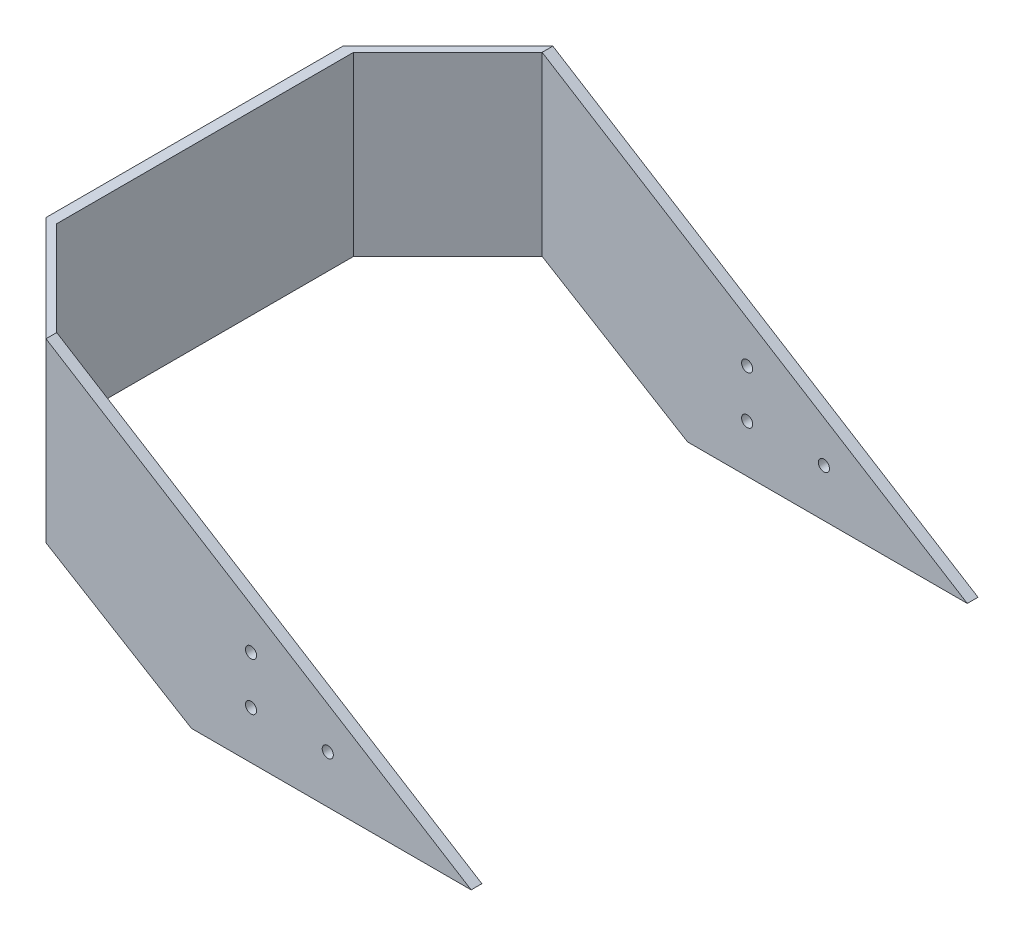
ISO-10303-21;
HEADER;
FILE_DESCRIPTION(('STEP AP214'),'2;1');
FILE_NAME('part.step','',(''),(''),'','','');
FILE_SCHEMA(('AUTOMOTIVE_DESIGN { 1 0 10303 214 1 1 1 1 }'));
ENDSEC;
DATA;
#1=APPLICATION_CONTEXT('core data for automotive mechanical design processes');
#2=APPLICATION_PROTOCOL_DEFINITION('international standard','automotive_design',2000,#1);
#3=PRODUCT_CONTEXT('',#1,'mechanical');
#4=PRODUCT('Part','Part','',(#3));
#5=PRODUCT_RELATED_PRODUCT_CATEGORY('part','',(#4));
#6=PRODUCT_DEFINITION_FORMATION('','',#4);
#7=PRODUCT_DEFINITION_CONTEXT('part definition',#1,'design');
#8=PRODUCT_DEFINITION('design','',#6,#7);
#9=PRODUCT_DEFINITION_SHAPE('','',#8);
#10=(LENGTH_UNIT() NAMED_UNIT(*) SI_UNIT(.MILLI.,.METRE.));
#11=(NAMED_UNIT(*) PLANE_ANGLE_UNIT() SI_UNIT($,.RADIAN.));
#12=(NAMED_UNIT(*) SI_UNIT($,.STERADIAN.) SOLID_ANGLE_UNIT());
#13=UNCERTAINTY_MEASURE_WITH_UNIT(LENGTH_MEASURE(1.E-05),#10,'distance_accuracy_value','');
#14=(GEOMETRIC_REPRESENTATION_CONTEXT(3) GLOBAL_UNCERTAINTY_ASSIGNED_CONTEXT((#13)) GLOBAL_UNIT_ASSIGNED_CONTEXT((#10,
#11,#12)) REPRESENTATION_CONTEXT('',''));
#15=CARTESIAN_POINT('',(0.,0.,0.));
#16=DIRECTION('',(0.,0.,1.));
#17=DIRECTION('',(1.,0.,0.));
#18=AXIS2_PLACEMENT_3D('',#15,#16,#17);
#19=CARTESIAN_POINT('',(0.,0.,-150.225396744416));
#20=DIRECTION('',(0.,0.,1.));
#21=DIRECTION('',(1.,0.,0.));
#22=AXIS2_PLACEMENT_3D('',#19,#20,#21);
#23=PLANE('',#22);
#24=CARTESIAN_POINT('',(-130.499303898,56.671423106,-150.225396744416));
#25=DIRECTION('',(0.,0.,-1.));
#26=DIRECTION('',(-1.,0.,0.));
#27=AXIS2_PLACEMENT_3D('',#24,#25,#26);
#28=CIRCLE('',#27,3.3);
#29=CARTESIAN_POINT('',(-133.799303898,56.671423106,-150.225396744416));
#30=VERTEX_POINT('',#29);
#31=EDGE_CURVE('E288',#30,#30,#28,.T.);
#32=ORIENTED_EDGE('',*,*,#31,.F.);
#33=EDGE_LOOP('',(#32));
#34=FACE_BOUND('',#33,.T.);
#35=CARTESIAN_POINT('',(-84.991984194,28.335711553,-150.225396744416));
#36=DIRECTION('',(0.,0.,-1.));
#37=DIRECTION('',(-1.,0.,0.));
#38=AXIS2_PLACEMENT_3D('',#35,#36,#37);
#39=CIRCLE('',#38,3.3);
#40=CARTESIAN_POINT('',(-88.291984194,28.335711553,-150.225396744416));
#41=VERTEX_POINT('',#40);
#42=EDGE_CURVE('E299',#41,#41,#39,.T.);
#43=ORIENTED_EDGE('',*,*,#42,.F.);
#44=EDGE_LOOP('',(#43));
#45=FACE_BOUND('',#44,.T.);
#46=DIRECTION('',(-0.855715818311566,0.517446072834037,0.));
#47=VECTOR('',#46,1.);
#48=CARTESIAN_POINT('',(-44.3905854683164,-73.4100192534136,-150.225396744416));
#49=LINE('',#48,#47);
#50=CARTESIAN_POINT('',(-165.790897492427,0.,-150.225396744416));
#51=VERTEX_POINT('',#50);
#52=CARTESIAN_POINT('',(-252.031500000006,52.1491599564427,-150.225396744416));
#53=VERTEX_POINT('',#52);
#54=EDGE_CURVE('E209',#51,#53,#49,.T.);
#55=ORIENTED_EDGE('',*,*,#54,.T.);
#56=DIRECTION('',(0.,-1.,0.));
#57=VECTOR('',#56,1.);
#58=CARTESIAN_POINT('',(-252.031500000007,156.924825641824,-150.225396744416));
#59=LINE('',#58,#57);
#60=CARTESIAN_POINT('',(-252.031500000007,156.924825641824,-150.225396744416));
#61=VERTEX_POINT('',#60);
#62=EDGE_CURVE('E121',#61,#53,#59,.T.);
#63=ORIENTED_EDGE('',*,*,#62,.F.);
#64=DIRECTION('',(-0.848897585926299,0.528557365485055,0.));
#65=VECTOR('',#64,1.);
#66=CARTESIAN_POINT('',(0.,0.,-150.225396744416));
#67=LINE('',#66,#65);
#68=CARTESIAN_POINT('',(0.,0.,-150.225396744416));
#69=VERTEX_POINT('',#68);
#70=EDGE_CURVE('E198',#69,#61,#67,.T.);
#71=ORIENTED_EDGE('',*,*,#70,.F.);
#72=DIRECTION('',(1.,0.,0.));
#73=VECTOR('',#72,1.);
#74=CARTESIAN_POINT('',(0.,0.,-150.225396744416));
#75=LINE('',#74,#73);
#76=EDGE_CURVE('E201',#51,#69,#75,.T.);
#77=ORIENTED_EDGE('',*,*,#76,.F.);
#78=EDGE_LOOP('',(#55,#63,#71,#77));
#79=FACE_BOUND('',#78,.T.);
#80=CARTESIAN_POINT('',(-130.499303898,28.335711553,-150.225396744416));
#81=DIRECTION('',(0.,0.,-1.));
#82=DIRECTION('',(-1.,0.,0.));
#83=AXIS2_PLACEMENT_3D('',#80,#81,#82);
#84=CIRCLE('',#83,3.3);
#85=CARTESIAN_POINT('',(-133.799303898,28.335711553,-150.225396744416));
#86=VERTEX_POINT('',#85);
#87=EDGE_CURVE('E282',#86,#86,#84,.T.);
#88=ORIENTED_EDGE('',*,*,#87,.F.);
#89=EDGE_LOOP('',(#88));
#90=FACE_BOUND('',#89,.T.);
#91=ADVANCED_FACE('F41',(#34,#45,#79,#90),#23,.F.);
#92=CARTESIAN_POINT('',(-307.906896744423,156.924825641824,0.));
#93=DIRECTION('',(-1.,0.,0.));
#94=DIRECTION('',(0.,0.,1.));
#95=AXIS2_PLACEMENT_3D('',#92,#93,#94);
#96=PLANE('',#95);
#97=DIRECTION('',(0.,0.,-1.));
#98=VECTOR('',#97,1.);
#99=CARTESIAN_POINT('',(-307.906896744423,52.1491599564428,0.));
#100=LINE('',#99,#98);
#101=CARTESIAN_POINT('',(-307.906896744423,52.1491599564428,88.));
#102=VERTEX_POINT('',#101);
#103=CARTESIAN_POINT('',(-307.906896744423,52.1491599564428,-88.));
#104=VERTEX_POINT('',#103);
#105=EDGE_CURVE('E145',#102,#104,#100,.T.);
#106=ORIENTED_EDGE('',*,*,#105,.T.);
#107=DIRECTION('',(0.,-1.,0.));
#108=VECTOR('',#107,1.);
#109=CARTESIAN_POINT('',(-307.906896744423,156.924825641824,-88.));
#110=LINE('',#109,#108);
#111=CARTESIAN_POINT('',(-307.906896744423,156.924825641824,-88.));
#112=VERTEX_POINT('',#111);
#113=EDGE_CURVE('E11',#112,#104,#110,.T.);
#114=ORIENTED_EDGE('',*,*,#113,.F.);
#115=DIRECTION('',(0.,0.,-1.));
#116=VECTOR('',#115,1.);
#117=CARTESIAN_POINT('',(-307.906896744423,156.924825641824,0.));
#118=LINE('',#117,#116);
#119=CARTESIAN_POINT('',(-307.906896744423,156.924825641824,88.));
#120=VERTEX_POINT('',#119);
#121=EDGE_CURVE('E164',#120,#112,#118,.T.);
#122=ORIENTED_EDGE('',*,*,#121,.F.);
#123=DIRECTION('',(0.,-1.,0.));
#124=VECTOR('',#123,1.);
#125=CARTESIAN_POINT('',(-307.906896744423,156.924825641824,88.));
#126=LINE('',#125,#124);
#127=EDGE_CURVE('E144',#120,#102,#126,.T.);
#128=ORIENTED_EDGE('',*,*,#127,.T.);
#129=EDGE_LOOP('',(#106,#114,#122,#128));
#130=FACE_BOUND('',#129,.T.);
#131=ADVANCED_FACE('F43',(#130),#96,.F.);
#132=CARTESIAN_POINT('',(-197.953448372211,156.924825641824,-197.953448372212));
#133=DIRECTION('',(-0.707106781186547,0.,-0.707106781186548));
#134=DIRECTION('',(-0.707106781186548,0.,0.707106781186547));
#135=AXIS2_PLACEMENT_3D('',#132,#133,#134);
#136=PLANE('',#135);
#137=DIRECTION('',(0.707106781186548,0.,-0.707106781186547));
#138=VECTOR('',#137,1.);
#139=CARTESIAN_POINT('',(-197.953448372211,52.1491599564428,-197.953448372212));
#140=LINE('',#139,#138);
#141=CARTESIAN_POINT('',(-252.031500000007,52.1491599564428,-143.875396744416));
#142=VERTEX_POINT('',#141);
#143=EDGE_CURVE('E148',#104,#142,#140,.T.);
#144=ORIENTED_EDGE('',*,*,#143,.T.);
#145=DIRECTION('',(0.,-1.,0.));
#146=VECTOR('',#145,1.);
#147=CARTESIAN_POINT('',(-252.031500000007,156.924825641824,-143.875396744416));
#148=LINE('',#147,#146);
#149=CARTESIAN_POINT('',(-252.031500000007,156.924825641824,-143.875396744416));
#150=VERTEX_POINT('',#149);
#151=EDGE_CURVE('E50',#150,#142,#148,.T.);
#152=ORIENTED_EDGE('',*,*,#151,.F.);
#153=DIRECTION('',(0.707106781186548,0.,-0.707106781186547));
#154=VECTOR('',#153,1.);
#155=CARTESIAN_POINT('',(-197.953448372211,156.924825641824,-197.953448372212));
#156=LINE('',#155,#154);
#157=EDGE_CURVE('E98',#112,#150,#156,.T.);
#158=ORIENTED_EDGE('',*,*,#157,.F.);
#159=ORIENTED_EDGE('',*,*,#113,.T.);
#160=EDGE_LOOP('',(#144,#152,#158,#159));
#161=FACE_BOUND('',#160,.T.);
#162=ADVANCED_FACE('F182',(#161),#136,.F.);
#163=CARTESIAN_POINT('',(-201.128448372211,156.924825641824,-201.128448372212));
#164=DIRECTION('',(-0.707106781186547,0.,-0.707106781186548));
#165=DIRECTION('',(-0.707106781186548,0.,0.707106781186547));
#166=AXIS2_PLACEMENT_3D('',#163,#164,#165);
#167=PLANE('',#166);
#168=DIRECTION('',(0.707106781186548,0.,-0.707106781186547));
#169=VECTOR('',#168,1.);
#170=CARTESIAN_POINT('',(-201.128448372211,52.1491599564428,-201.128448372212));
#171=LINE('',#170,#169);
#172=CARTESIAN_POINT('',(-314.256896744423,52.1491599564428,-88.));
#173=VERTEX_POINT('',#172);
#174=EDGE_CURVE('E118',#173,#53,#171,.T.);
#175=ORIENTED_EDGE('',*,*,#174,.F.);
#176=DIRECTION('',(0.,-1.,0.));
#177=VECTOR('',#176,1.);
#178=CARTESIAN_POINT('',(-314.256896744423,156.924825641824,-88.));
#179=LINE('',#178,#177);
#180=CARTESIAN_POINT('',(-314.256896744423,156.924825641824,-88.));
#181=VERTEX_POINT('',#180);
#182=EDGE_CURVE('E110',#181,#173,#179,.T.);
#183=ORIENTED_EDGE('',*,*,#182,.F.);
#184=DIRECTION('',(0.707106781186548,0.,-0.707106781186547));
#185=VECTOR('',#184,1.);
#186=CARTESIAN_POINT('',(-201.128448372211,156.924825641824,-201.128448372212));
#187=LINE('',#186,#185);
#188=EDGE_CURVE('E115',#181,#61,#187,.T.);
#189=ORIENTED_EDGE('',*,*,#188,.T.);
#190=ORIENTED_EDGE('',*,*,#62,.T.);
#191=EDGE_LOOP('',(#175,#183,#189,#190));
#192=FACE_BOUND('',#191,.T.);
#193=ADVANCED_FACE('F112',(#192),#167,.T.);
#194=CARTESIAN_POINT('',(-314.256896744423,156.924825641824,0.));
#195=DIRECTION('',(1.,0.,0.));
#196=DIRECTION('',(0.,0.,-1.));
#197=AXIS2_PLACEMENT_3D('',#194,#195,#196);
#198=PLANE('',#197);
#199=DIRECTION('',(0.,0.,1.));
#200=VECTOR('',#199,1.);
#201=CARTESIAN_POINT('',(-314.256896744423,52.1491599564428,0.));
#202=LINE('',#201,#200);
#203=CARTESIAN_POINT('',(-314.256896744423,52.1491599564428,88.));
#204=VERTEX_POINT('',#203);
#205=EDGE_CURVE('E155',#173,#204,#202,.T.);
#206=ORIENTED_EDGE('',*,*,#205,.T.);
#207=DIRECTION('',(0.,-1.,0.));
#208=VECTOR('',#207,1.);
#209=CARTESIAN_POINT('',(-314.256896744423,156.924825641824,88.));
#210=LINE('',#209,#208);
#211=CARTESIAN_POINT('',(-314.256896744423,156.924825641824,88.));
#212=VERTEX_POINT('',#211);
#213=EDGE_CURVE('E122',#212,#204,#210,.T.);
#214=ORIENTED_EDGE('',*,*,#213,.F.);
#215=DIRECTION('',(0.,0.,1.));
#216=VECTOR('',#215,1.);
#217=CARTESIAN_POINT('',(-314.256896744423,156.924825641824,0.));
#218=LINE('',#217,#216);
#219=EDGE_CURVE('E125',#181,#212,#218,.T.);
#220=ORIENTED_EDGE('',*,*,#219,.F.);
#221=ORIENTED_EDGE('',*,*,#182,.T.);
#222=EDGE_LOOP('',(#206,#214,#220,#221));
#223=FACE_BOUND('',#222,.T.);
#224=ADVANCED_FACE('F126',(#223),#198,.F.);
#225=CARTESIAN_POINT('',(-201.128448372212,156.924825641824,201.128448372212));
#226=DIRECTION('',(0.707106781186548,0.,-0.707106781186547));
#227=DIRECTION('',(-0.707106781186547,0.,-0.707106781186548));
#228=AXIS2_PLACEMENT_3D('',#225,#226,#227);
#229=PLANE('',#228);
#230=DIRECTION('',(0.707106781186547,0.,0.707106781186548));
#231=VECTOR('',#230,1.);
#232=CARTESIAN_POINT('',(-201.128448372212,52.1491599564428,201.128448372212));
#233=LINE('',#232,#231);
#234=CARTESIAN_POINT('',(-252.031500000006,52.1491599564428,150.225396744417));
#235=VERTEX_POINT('',#234);
#236=EDGE_CURVE('E157',#204,#235,#233,.T.);
#237=ORIENTED_EDGE('',*,*,#236,.T.);
#238=DIRECTION('',(0.,-1.,0.));
#239=VECTOR('',#238,1.);
#240=CARTESIAN_POINT('',(-252.031500000006,156.924825641824,150.225396744417));
#241=LINE('',#240,#239);
#242=CARTESIAN_POINT('',(-252.031500000006,156.924825641824,150.225396744414));
#243=VERTEX_POINT('',#242);
#244=EDGE_CURVE('E168',#243,#235,#241,.T.);
#245=ORIENTED_EDGE('',*,*,#244,.F.);
#246=DIRECTION('',(0.707106781186547,0.,0.707106781186548));
#247=VECTOR('',#246,1.);
#248=CARTESIAN_POINT('',(-201.128448372212,156.924825641824,201.128448372212));
#249=LINE('',#248,#247);
#250=EDGE_CURVE('E130',#212,#243,#249,.T.);
#251=ORIENTED_EDGE('',*,*,#250,.F.);
#252=ORIENTED_EDGE('',*,*,#213,.T.);
#253=EDGE_LOOP('',(#237,#245,#251,#252));
#254=FACE_BOUND('',#253,.T.);
#255=ADVANCED_FACE('F351',(#254),#229,.F.);
#256=CARTESIAN_POINT('',(-197.953448372212,156.924825641824,197.953448372212));
#257=DIRECTION('',(-0.707106781186548,0.,0.707106781186547));
#258=DIRECTION('',(0.707106781186547,0.,0.707106781186548));
#259=AXIS2_PLACEMENT_3D('',#256,#257,#258);
#260=PLANE('',#259);
#261=DIRECTION('',(-0.707106781186547,0.,-0.707106781186548));
#262=VECTOR('',#261,1.);
#263=CARTESIAN_POINT('',(-197.953448372212,52.1491599564428,197.953448372212));
#264=LINE('',#263,#262);
#265=CARTESIAN_POINT('',(-252.031500000006,52.1491599564427,143.875396744417));
#266=VERTEX_POINT('',#265);
#267=EDGE_CURVE('E90',#266,#102,#264,.T.);
#268=ORIENTED_EDGE('',*,*,#267,.T.);
#269=ORIENTED_EDGE('',*,*,#127,.F.);
#270=DIRECTION('',(-0.707106781186547,0.,-0.707106781186548));
#271=VECTOR('',#270,1.);
#272=CARTESIAN_POINT('',(-197.953448372212,156.924825641824,197.953448372212));
#273=LINE('',#272,#271);
#274=CARTESIAN_POINT('',(-252.031500000006,156.924825641824,143.875396744417));
#275=VERTEX_POINT('',#274);
#276=EDGE_CURVE('E58',#275,#120,#273,.T.);
#277=ORIENTED_EDGE('',*,*,#276,.F.);
#278=DIRECTION('',(0.,-1.,0.));
#279=VECTOR('',#278,1.);
#280=CARTESIAN_POINT('',(-252.031500000006,156.924825641824,143.875396744417));
#281=LINE('',#280,#279);
#282=EDGE_CURVE('E166',#275,#266,#281,.T.);
#283=ORIENTED_EDGE('',*,*,#282,.T.);
#284=EDGE_LOOP('',(#268,#269,#277,#283));
#285=FACE_BOUND('',#284,.T.);
#286=ADVANCED_FACE('F346',(#285),#260,.F.);
#287=CARTESIAN_POINT('',(0.,156.924825641824,0.));
#288=DIRECTION('',(0.,1.,0.));
#289=DIRECTION('',(0.,0.,1.));
#290=AXIS2_PLACEMENT_3D('',#287,#288,#289);
#291=PLANE('',#290);
#292=ORIENTED_EDGE('',*,*,#121,.T.);
#293=ORIENTED_EDGE('',*,*,#157,.T.);
#294=DIRECTION('',(0.,0.,-1.));
#295=VECTOR('',#294,1.);
#296=CARTESIAN_POINT('',(-252.031500000007,156.924825641824,0.));
#297=LINE('',#296,#295);
#298=EDGE_CURVE('E134',#150,#61,#297,.T.);
#299=ORIENTED_EDGE('',*,*,#298,.T.);
#300=ORIENTED_EDGE('',*,*,#188,.F.);
#301=ORIENTED_EDGE('',*,*,#219,.T.);
#302=ORIENTED_EDGE('',*,*,#250,.T.);
#303=DIRECTION('',(0.,0.,1.));
#304=VECTOR('',#303,1.);
#305=CARTESIAN_POINT('',(-252.031499999996,156.924825641824,-1.76259007389496E-11));
#306=LINE('',#305,#304);
#307=EDGE_CURVE('E140',#275,#243,#306,.T.);
#308=ORIENTED_EDGE('',*,*,#307,.F.);
#309=ORIENTED_EDGE('',*,*,#276,.T.);
#310=EDGE_LOOP('',(#292,#293,#299,#300,#301,#302,#308,#309));
#311=FACE_BOUND('',#310,.T.);
#312=ADVANCED_FACE('F132',(#311),#291,.T.);
#313=CARTESIAN_POINT('',(0.,52.1491599564428,0.));
#314=DIRECTION('',(0.,1.,0.));
#315=DIRECTION('',(0.,0.,1.));
#316=AXIS2_PLACEMENT_3D('',#313,#314,#315);
#317=PLANE('',#316);
#318=ORIENTED_EDGE('',*,*,#105,.F.);
#319=ORIENTED_EDGE('',*,*,#267,.F.);
#320=DIRECTION('',(0.,0.,1.));
#321=VECTOR('',#320,1.);
#322=CARTESIAN_POINT('',(-252.031499999996,52.1491599564428,-1.76259007389496E-11));
#323=LINE('',#322,#321);
#324=EDGE_CURVE('E160',#266,#235,#323,.T.);
#325=ORIENTED_EDGE('',*,*,#324,.T.);
#326=ORIENTED_EDGE('',*,*,#236,.F.);
#327=ORIENTED_EDGE('',*,*,#205,.F.);
#328=ORIENTED_EDGE('',*,*,#174,.T.);
#329=DIRECTION('',(0.,0.,-1.));
#330=VECTOR('',#329,1.);
#331=CARTESIAN_POINT('',(-252.031500000007,52.1491599564428,0.));
#332=LINE('',#331,#330);
#333=EDGE_CURVE('E151',#142,#53,#332,.T.);
#334=ORIENTED_EDGE('',*,*,#333,.F.);
#335=ORIENTED_EDGE('',*,*,#143,.F.);
#336=EDGE_LOOP('',(#318,#319,#325,#326,#327,#328,#334,#335));
#337=FACE_BOUND('',#336,.T.);
#338=ADVANCED_FACE('F187',(#337),#317,.F.);
#339=CARTESIAN_POINT('',(-44.3905854683164,-73.4100192534136,143.875396744417));
#340=DIRECTION('',(0.517446072834037,0.855715818311566,0.));
#341=DIRECTION('',(-0.855715818311566,0.517446072834037,0.));
#342=AXIS2_PLACEMENT_3D('',#339,#340,#341);
#343=PLANE('',#342);
#344=DIRECTION('',(-0.855715818311566,0.517446072834037,0.));
#345=VECTOR('',#344,1.);
#346=CARTESIAN_POINT('',(-44.3905854683164,-73.4100192534136,150.225396744414));
#347=LINE('',#346,#345);
#348=CARTESIAN_POINT('',(-165.790897492427,0.,150.225396744414));
#349=VERTEX_POINT('',#348);
#350=EDGE_CURVE('E83',#349,#235,#347,.T.);
#351=ORIENTED_EDGE('',*,*,#350,.T.);
#352=ORIENTED_EDGE('',*,*,#324,.F.);
#353=DIRECTION('',(-0.855715818311566,0.517446072834037,0.));
#354=VECTOR('',#353,1.);
#355=CARTESIAN_POINT('',(-44.3905854683164,-73.4100192534136,143.875396744417));
#356=LINE('',#355,#354);
#357=CARTESIAN_POINT('',(-165.790897492427,0.,143.875396744417));
#358=VERTEX_POINT('',#357);
#359=EDGE_CURVE('E216',#358,#266,#356,.T.);
#360=ORIENTED_EDGE('',*,*,#359,.F.);
#361=DIRECTION('',(0.,0.,1.));
#362=VECTOR('',#361,1.);
#363=CARTESIAN_POINT('',(-165.790897492427,0.,143.875396744417));
#364=LINE('',#363,#362);
#365=EDGE_CURVE('E226',#358,#349,#364,.T.);
#366=ORIENTED_EDGE('',*,*,#365,.T.);
#367=EDGE_LOOP('',(#351,#352,#360,#366));
#368=FACE_BOUND('',#367,.T.);
#369=ADVANCED_FACE('F339',(#368),#343,.F.);
#370=CARTESIAN_POINT('',(0.,0.,143.875396744417));
#371=DIRECTION('',(0.528557365485055,0.848897585926299,0.));
#372=DIRECTION('',(-0.848897585926299,0.528557365485055,0.));
#373=AXIS2_PLACEMENT_3D('',#370,#371,#372);
#374=PLANE('',#373);
#375=DIRECTION('',(-0.848897585926299,0.528557365485055,0.));
#376=VECTOR('',#375,1.);
#377=CARTESIAN_POINT('',(0.,0.,150.225396744414));
#378=LINE('',#377,#376);
#379=CARTESIAN_POINT('',(0.,0.,150.225396744414));
#380=VERTEX_POINT('',#379);
#381=EDGE_CURVE('E220',#380,#243,#378,.T.);
#382=ORIENTED_EDGE('',*,*,#381,.F.);
#383=DIRECTION('',(0.,0.,1.));
#384=VECTOR('',#383,1.);
#385=CARTESIAN_POINT('',(0.,0.,143.875396744417));
#386=LINE('',#385,#384);
#387=CARTESIAN_POINT('',(0.,0.,143.875396744417));
#388=VERTEX_POINT('',#387);
#389=EDGE_CURVE('E149',#388,#380,#386,.T.);
#390=ORIENTED_EDGE('',*,*,#389,.F.);
#391=DIRECTION('',(-0.848897585926299,0.528557365485055,0.));
#392=VECTOR('',#391,1.);
#393=CARTESIAN_POINT('',(0.,0.,143.875396744417));
#394=LINE('',#393,#392);
#395=EDGE_CURVE('E223',#388,#275,#394,.T.);
#396=ORIENTED_EDGE('',*,*,#395,.T.);
#397=ORIENTED_EDGE('',*,*,#307,.T.);
#398=EDGE_LOOP('',(#382,#390,#396,#397));
#399=FACE_BOUND('',#398,.T.);
#400=ADVANCED_FACE('F336',(#399),#374,.T.);
#401=CARTESIAN_POINT('',(0.,0.,143.875396744417));
#402=DIRECTION('',(0.,-1.,0.));
#403=DIRECTION('',(0.,0.,-1.));
#404=AXIS2_PLACEMENT_3D('',#401,#402,#403);
#405=PLANE('',#404);
#406=DIRECTION('',(1.,0.,0.));
#407=VECTOR('',#406,1.);
#408=CARTESIAN_POINT('',(0.,0.,150.225396744414));
#409=LINE('',#408,#407);
#410=EDGE_CURVE('E228',#349,#380,#409,.T.);
#411=ORIENTED_EDGE('',*,*,#410,.F.);
#412=ORIENTED_EDGE('',*,*,#365,.F.);
#413=DIRECTION('',(1.,0.,0.));
#414=VECTOR('',#413,1.);
#415=CARTESIAN_POINT('',(0.,0.,143.875396744417));
#416=LINE('',#415,#414);
#417=EDGE_CURVE('E219',#358,#388,#416,.T.);
#418=ORIENTED_EDGE('',*,*,#417,.T.);
#419=ORIENTED_EDGE('',*,*,#389,.T.);
#420=EDGE_LOOP('',(#411,#412,#418,#419));
#421=FACE_BOUND('',#420,.T.);
#422=ADVANCED_FACE('F331',(#421),#405,.T.);
#423=CARTESIAN_POINT('',(0.,0.,143.875396744417));
#424=DIRECTION('',(0.,0.,1.));
#425=DIRECTION('',(1.,0.,0.));
#426=AXIS2_PLACEMENT_3D('',#423,#424,#425);
#427=PLANE('',#426);
#428=CARTESIAN_POINT('',(-130.499303898,28.335711553,143.875396744417));
#429=DIRECTION('',(0.,0.,1.));
#430=DIRECTION('',(1.,0.,0.));
#431=AXIS2_PLACEMENT_3D('',#428,#429,#430);
#432=CIRCLE('',#431,3.3);
#433=CARTESIAN_POINT('',(-127.199303898,28.335711553,143.875396744417));
#434=VERTEX_POINT('',#433);
#435=EDGE_CURVE('E555',#434,#434,#432,.T.);
#436=ORIENTED_EDGE('',*,*,#435,.T.);
#437=EDGE_LOOP('',(#436));
#438=FACE_BOUND('',#437,.T.);
#439=CARTESIAN_POINT('',(-130.499303898,56.671423106,143.875396744417));
#440=DIRECTION('',(0.,0.,1.));
#441=DIRECTION('',(1.,0.,0.));
#442=AXIS2_PLACEMENT_3D('',#439,#440,#441);
#443=CIRCLE('',#442,3.3);
#444=CARTESIAN_POINT('',(-127.199303898,56.671423106,143.875396744417));
#445=VERTEX_POINT('',#444);
#446=EDGE_CURVE('E565',#445,#445,#443,.T.);
#447=ORIENTED_EDGE('',*,*,#446,.T.);
#448=EDGE_LOOP('',(#447));
#449=FACE_BOUND('',#448,.T.);
#450=CARTESIAN_POINT('',(-84.991984194,28.335711553,143.875396744417));
#451=DIRECTION('',(0.,0.,1.));
#452=DIRECTION('',(1.,0.,0.));
#453=AXIS2_PLACEMENT_3D('',#450,#451,#452);
#454=CIRCLE('',#453,3.3);
#455=CARTESIAN_POINT('',(-81.691984194,28.335711553,143.875396744417));
#456=VERTEX_POINT('',#455);
#457=EDGE_CURVE('E285',#456,#456,#454,.T.);
#458=ORIENTED_EDGE('',*,*,#457,.T.);
#459=EDGE_LOOP('',(#458));
#460=FACE_BOUND('',#459,.T.);
#461=ORIENTED_EDGE('',*,*,#359,.T.);
#462=ORIENTED_EDGE('',*,*,#282,.F.);
#463=ORIENTED_EDGE('',*,*,#395,.F.);
#464=ORIENTED_EDGE('',*,*,#417,.F.);
#465=EDGE_LOOP('',(#461,#462,#463,#464));
#466=FACE_BOUND('',#465,.T.);
#467=ADVANCED_FACE('F328',(#438,#449,#460,#466),#427,.F.);
#468=CARTESIAN_POINT('',(0.,0.,150.225396744414));
#469=DIRECTION('',(0.,0.,1.));
#470=DIRECTION('',(1.,0.,0.));
#471=AXIS2_PLACEMENT_3D('',#468,#469,#470);
#472=PLANE('',#471);
#473=CARTESIAN_POINT('',(-130.499303898,28.335711553,150.225396744414));
#474=DIRECTION('',(0.,0.,1.));
#475=DIRECTION('',(1.,0.,0.));
#476=AXIS2_PLACEMENT_3D('',#473,#474,#475);
#477=CIRCLE('',#476,3.3);
#478=CARTESIAN_POINT('',(-127.199303898,28.335711553,150.225396744414));
#479=VERTEX_POINT('',#478);
#480=EDGE_CURVE('E558',#479,#479,#477,.T.);
#481=ORIENTED_EDGE('',*,*,#480,.F.);
#482=EDGE_LOOP('',(#481));
#483=FACE_BOUND('',#482,.T.);
#484=CARTESIAN_POINT('',(-130.499303898,56.671423106,150.225396744414));
#485=DIRECTION('',(0.,0.,1.));
#486=DIRECTION('',(1.,0.,0.));
#487=AXIS2_PLACEMENT_3D('',#484,#485,#486);
#488=CIRCLE('',#487,3.3);
#489=CARTESIAN_POINT('',(-127.199303898,56.671423106,150.225396744414));
#490=VERTEX_POINT('',#489);
#491=EDGE_CURVE('E560',#490,#490,#488,.T.);
#492=ORIENTED_EDGE('',*,*,#491,.F.);
#493=EDGE_LOOP('',(#492));
#494=FACE_BOUND('',#493,.T.);
#495=CARTESIAN_POINT('',(-84.991984194,28.335711553,150.225396744414));
#496=DIRECTION('',(0.,0.,1.));
#497=DIRECTION('',(1.,0.,0.));
#498=AXIS2_PLACEMENT_3D('',#495,#496,#497);
#499=CIRCLE('',#498,3.3);
#500=CARTESIAN_POINT('',(-81.691984194,28.335711553,150.225396744414));
#501=VERTEX_POINT('',#500);
#502=EDGE_CURVE('E291',#501,#501,#499,.T.);
#503=ORIENTED_EDGE('',*,*,#502,.F.);
#504=EDGE_LOOP('',(#503));
#505=FACE_BOUND('',#504,.T.);
#506=ORIENTED_EDGE('',*,*,#350,.F.);
#507=ORIENTED_EDGE('',*,*,#410,.T.);
#508=ORIENTED_EDGE('',*,*,#381,.T.);
#509=ORIENTED_EDGE('',*,*,#244,.T.);
#510=EDGE_LOOP('',(#506,#507,#508,#509));
#511=FACE_BOUND('',#510,.T.);
#512=ADVANCED_FACE('F327',(#483,#494,#505,#511),#472,.T.);
#513=CARTESIAN_POINT('',(-44.3905854683164,-73.4100192534136,-143.875396744416));
#514=DIRECTION('',(-0.517446072834037,-0.855715818311566,0.));
#515=DIRECTION('',(0.855715818311566,-0.517446072834037,0.));
#516=AXIS2_PLACEMENT_3D('',#513,#514,#515);
#517=PLANE('',#516);
#518=ORIENTED_EDGE('',*,*,#54,.F.);
#519=DIRECTION('',(0.,0.,-1.));
#520=VECTOR('',#519,1.);
#521=CARTESIAN_POINT('',(-165.790897492427,0.,-143.875396744416));
#522=LINE('',#521,#520);
#523=CARTESIAN_POINT('',(-165.790897492427,0.,-143.875396744416));
#524=VERTEX_POINT('',#523);
#525=EDGE_CURVE('E195',#524,#51,#522,.T.);
#526=ORIENTED_EDGE('',*,*,#525,.F.);
#527=DIRECTION('',(-0.855715818311566,0.517446072834037,0.));
#528=VECTOR('',#527,1.);
#529=CARTESIAN_POINT('',(-44.3905854683164,-73.4100192534136,-143.875396744416));
#530=LINE('',#529,#528);
#531=EDGE_CURVE('E179',#524,#142,#530,.T.);
#532=ORIENTED_EDGE('',*,*,#531,.T.);
#533=ORIENTED_EDGE('',*,*,#333,.T.);
#534=EDGE_LOOP('',(#518,#526,#532,#533));
#535=FACE_BOUND('',#534,.T.);
#536=ADVANCED_FACE('F193',(#535),#517,.T.);
#537=CARTESIAN_POINT('',(0.,0.,-143.875396744416));
#538=DIRECTION('',(0.,1.,0.));
#539=DIRECTION('',(0.,0.,1.));
#540=AXIS2_PLACEMENT_3D('',#537,#538,#539);
#541=PLANE('',#540);
#542=ORIENTED_EDGE('',*,*,#76,.T.);
#543=DIRECTION('',(0.,0.,-1.));
#544=VECTOR('',#543,1.);
#545=CARTESIAN_POINT('',(0.,0.,-143.875396744416));
#546=LINE('',#545,#544);
#547=CARTESIAN_POINT('',(0.,0.,-143.875396744416));
#548=VERTEX_POINT('',#547);
#549=EDGE_CURVE('E208',#548,#69,#546,.T.);
#550=ORIENTED_EDGE('',*,*,#549,.F.);
#551=DIRECTION('',(1.,0.,0.));
#552=VECTOR('',#551,1.);
#553=CARTESIAN_POINT('',(0.,0.,-143.875396744416));
#554=LINE('',#553,#552);
#555=EDGE_CURVE('E197',#524,#548,#554,.T.);
#556=ORIENTED_EDGE('',*,*,#555,.F.);
#557=ORIENTED_EDGE('',*,*,#525,.T.);
#558=EDGE_LOOP('',(#542,#550,#556,#557));
#559=FACE_BOUND('',#558,.T.);
#560=ADVANCED_FACE('F269',(#559),#541,.F.);
#561=CARTESIAN_POINT('',(0.,0.,-143.875396744416));
#562=DIRECTION('',(-0.528557365485055,-0.848897585926299,0.));
#563=DIRECTION('',(0.848897585926299,-0.528557365485055,0.));
#564=AXIS2_PLACEMENT_3D('',#561,#562,#563);
#565=PLANE('',#564);
#566=ORIENTED_EDGE('',*,*,#70,.T.);
#567=ORIENTED_EDGE('',*,*,#298,.F.);
#568=DIRECTION('',(-0.848897585926299,0.528557365485055,0.));
#569=VECTOR('',#568,1.);
#570=CARTESIAN_POINT('',(0.,0.,-143.875396744416));
#571=LINE('',#570,#569);
#572=EDGE_CURVE('E181',#548,#150,#571,.T.);
#573=ORIENTED_EDGE('',*,*,#572,.F.);
#574=ORIENTED_EDGE('',*,*,#549,.T.);
#575=EDGE_LOOP('',(#566,#567,#573,#574));
#576=FACE_BOUND('',#575,.T.);
#577=ADVANCED_FACE('F273',(#576),#565,.F.);
#578=CARTESIAN_POINT('',(0.,0.,-143.875396744416));
#579=DIRECTION('',(0.,0.,1.));
#580=DIRECTION('',(1.,0.,0.));
#581=AXIS2_PLACEMENT_3D('',#578,#579,#580);
#582=PLANE('',#581);
#583=CARTESIAN_POINT('',(-130.499303898,28.335711553,-143.875396744416));
#584=DIRECTION('',(0.,0.,1.));
#585=DIRECTION('',(1.,0.,0.));
#586=AXIS2_PLACEMENT_3D('',#583,#584,#585);
#587=CIRCLE('',#586,3.3);
#588=CARTESIAN_POINT('',(-127.199303898,28.335711553,-143.875396744416));
#589=VERTEX_POINT('',#588);
#590=EDGE_CURVE('E284',#589,#589,#587,.T.);
#591=ORIENTED_EDGE('',*,*,#590,.F.);
#592=EDGE_LOOP('',(#591));
#593=FACE_BOUND('',#592,.T.);
#594=CARTESIAN_POINT('',(-130.499303898,56.671423106,-143.875396744416));
#595=DIRECTION('',(0.,0.,1.));
#596=DIRECTION('',(1.,0.,0.));
#597=AXIS2_PLACEMENT_3D('',#594,#595,#596);
#598=CIRCLE('',#597,3.3);
#599=CARTESIAN_POINT('',(-127.199303898,56.671423106,-143.875396744416));
#600=VERTEX_POINT('',#599);
#601=EDGE_CURVE('E297',#600,#600,#598,.T.);
#602=ORIENTED_EDGE('',*,*,#601,.F.);
#603=EDGE_LOOP('',(#602));
#604=FACE_BOUND('',#603,.T.);
#605=CARTESIAN_POINT('',(-84.991984194,28.335711553,-143.875396744416));
#606=DIRECTION('',(0.,0.,1.));
#607=DIRECTION('',(1.,0.,0.));
#608=AXIS2_PLACEMENT_3D('',#605,#606,#607);
#609=CIRCLE('',#608,3.3);
#610=CARTESIAN_POINT('',(-81.691984194,28.335711553,-143.875396744416));
#611=VERTEX_POINT('',#610);
#612=EDGE_CURVE('E204',#611,#611,#609,.T.);
#613=ORIENTED_EDGE('',*,*,#612,.F.);
#614=EDGE_LOOP('',(#613));
#615=FACE_BOUND('',#614,.T.);
#616=ORIENTED_EDGE('',*,*,#531,.F.);
#617=ORIENTED_EDGE('',*,*,#555,.T.);
#618=ORIENTED_EDGE('',*,*,#572,.T.);
#619=ORIENTED_EDGE('',*,*,#151,.T.);
#620=EDGE_LOOP('',(#616,#617,#618,#619));
#621=FACE_BOUND('',#620,.T.);
#622=ADVANCED_FACE('F175',(#593,#604,#615,#621),#582,.T.);
#623=CARTESIAN_POINT('',(-84.991984194,28.335711553,-150.225396744416));
#624=DIRECTION('',(0.,0.,-1.));
#625=DIRECTION('',(-1.,0.,0.));
#626=AXIS2_PLACEMENT_3D('',#623,#624,#625);
#627=CYLINDRICAL_SURFACE('',#626,3.3);
#628=ORIENTED_EDGE('',*,*,#42,.T.);
#629=EDGE_LOOP('',(#628));
#630=FACE_BOUND('',#629,.T.);
#631=ORIENTED_EDGE('',*,*,#612,.T.);
#632=EDGE_LOOP('',(#631));
#633=FACE_BOUND('',#632,.T.);
#634=ADVANCED_FACE('F306',(#630,#633),#627,.F.);
#635=CARTESIAN_POINT('',(-130.499303898,56.671423106,-150.225396744416));
#636=DIRECTION('',(0.,0.,-1.));
#637=DIRECTION('',(-1.,0.,0.));
#638=AXIS2_PLACEMENT_3D('',#635,#636,#637);
#639=CYLINDRICAL_SURFACE('',#638,3.3);
#640=ORIENTED_EDGE('',*,*,#31,.T.);
#641=EDGE_LOOP('',(#640));
#642=FACE_BOUND('',#641,.T.);
#643=ORIENTED_EDGE('',*,*,#601,.T.);
#644=EDGE_LOOP('',(#643));
#645=FACE_BOUND('',#644,.T.);
#646=ADVANCED_FACE('F315',(#642,#645),#639,.F.);
#647=CARTESIAN_POINT('',(-130.499303898,28.335711553,-150.225396744416));
#648=DIRECTION('',(0.,0.,-1.));
#649=DIRECTION('',(-1.,0.,0.));
#650=AXIS2_PLACEMENT_3D('',#647,#648,#649);
#651=CYLINDRICAL_SURFACE('',#650,3.3);
#652=ORIENTED_EDGE('',*,*,#87,.T.);
#653=EDGE_LOOP('',(#652));
#654=FACE_BOUND('',#653,.T.);
#655=ORIENTED_EDGE('',*,*,#590,.T.);
#656=EDGE_LOOP('',(#655));
#657=FACE_BOUND('',#656,.T.);
#658=ADVANCED_FACE('F503',(#654,#657),#651,.F.);
#659=CARTESIAN_POINT('',(-84.991984194,28.335711553,150.225396744414));
#660=DIRECTION('',(0.,0.,1.));
#661=DIRECTION('',(1.,0.,0.));
#662=AXIS2_PLACEMENT_3D('',#659,#660,#661);
#663=CYLINDRICAL_SURFACE('',#662,3.3);
#664=ORIENTED_EDGE('',*,*,#457,.F.);
#665=EDGE_LOOP('',(#664));
#666=FACE_BOUND('',#665,.T.);
#667=ORIENTED_EDGE('',*,*,#502,.T.);
#668=EDGE_LOOP('',(#667));
#669=FACE_BOUND('',#668,.T.);
#670=ADVANCED_FACE('F512',(#666,#669),#663,.F.);
#671=CARTESIAN_POINT('',(-130.499303898,56.671423106,150.225396744414));
#672=DIRECTION('',(0.,0.,1.));
#673=DIRECTION('',(1.,0.,0.));
#674=AXIS2_PLACEMENT_3D('',#671,#672,#673);
#675=CYLINDRICAL_SURFACE('',#674,3.3);
#676=ORIENTED_EDGE('',*,*,#446,.F.);
#677=EDGE_LOOP('',(#676));
#678=FACE_BOUND('',#677,.T.);
#679=ORIENTED_EDGE('',*,*,#491,.T.);
#680=EDGE_LOOP('',(#679));
#681=FACE_BOUND('',#680,.T.);
#682=ADVANCED_FACE('F521',(#678,#681),#675,.F.);
#683=CARTESIAN_POINT('',(-130.499303898,28.335711553,150.225396744414));
#684=DIRECTION('',(0.,0.,1.));
#685=DIRECTION('',(1.,0.,0.));
#686=AXIS2_PLACEMENT_3D('',#683,#684,#685);
#687=CYLINDRICAL_SURFACE('',#686,3.3);
#688=ORIENTED_EDGE('',*,*,#435,.F.);
#689=EDGE_LOOP('',(#688));
#690=FACE_BOUND('',#689,.T.);
#691=ORIENTED_EDGE('',*,*,#480,.T.);
#692=EDGE_LOOP('',(#691));
#693=FACE_BOUND('',#692,.T.);
#694=ADVANCED_FACE('F532',(#690,#693),#687,.F.);
#695=CLOSED_SHELL('',(#91,#131,#162,#193,#224,#255,#286,#312,#338,#369,#400,#422,#467,#512,#536,
#560,#577,#622,#634,#646,#658,#670,#682,#694));
#696=MANIFOLD_SOLID_BREP('B2',#695);
#697=ADVANCED_BREP_SHAPE_REPRESENTATION('',(#18,#696),#14);
#698=SHAPE_DEFINITION_REPRESENTATION(#9,#697);
ENDSEC;
END-ISO-10303-21;
